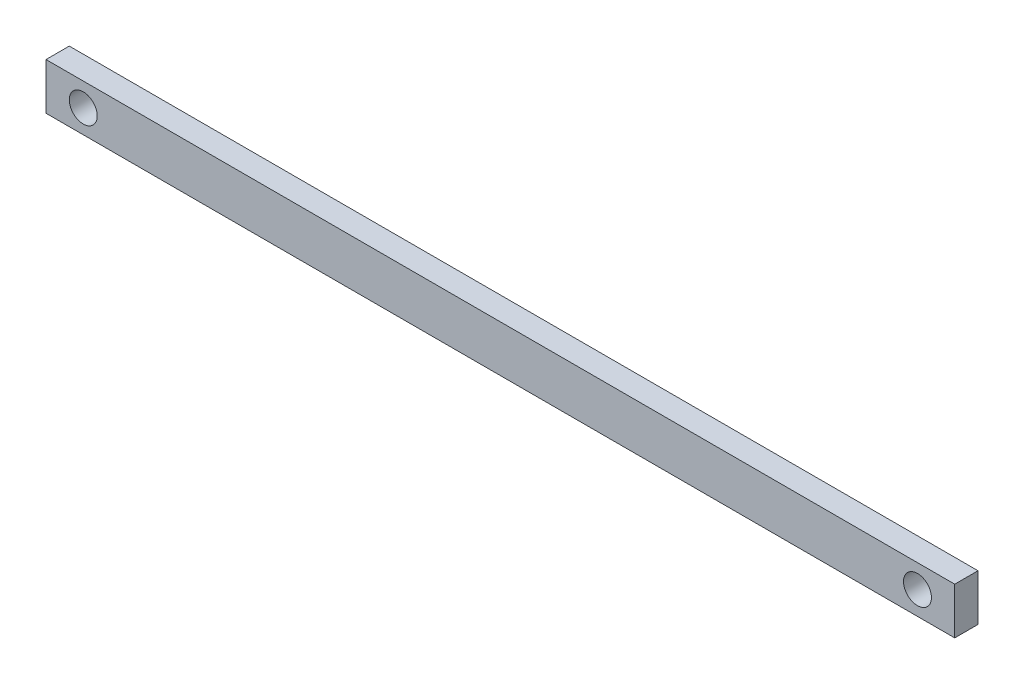
ISO-10303-21;
HEADER;
FILE_DESCRIPTION(('STEP AP214'),'2;1');
FILE_NAME('part.step','',(''),(''),'','','');
FILE_SCHEMA(('AUTOMOTIVE_DESIGN { 1 0 10303 214 1 1 1 1 }'));
ENDSEC;
DATA;
#1=APPLICATION_CONTEXT('core data for automotive mechanical design processes');
#2=APPLICATION_PROTOCOL_DEFINITION('international standard','automotive_design',2000,#1);
#3=PRODUCT_CONTEXT('',#1,'mechanical');
#4=PRODUCT('Part','Part','',(#3));
#5=PRODUCT_RELATED_PRODUCT_CATEGORY('part','',(#4));
#6=PRODUCT_DEFINITION_FORMATION('','',#4);
#7=PRODUCT_DEFINITION_CONTEXT('part definition',#1,'design');
#8=PRODUCT_DEFINITION('design','',#6,#7);
#9=PRODUCT_DEFINITION_SHAPE('','',#8);
#10=(LENGTH_UNIT() NAMED_UNIT(*) SI_UNIT(.MILLI.,.METRE.));
#11=(NAMED_UNIT(*) PLANE_ANGLE_UNIT() SI_UNIT($,.RADIAN.));
#12=(NAMED_UNIT(*) SI_UNIT($,.STERADIAN.) SOLID_ANGLE_UNIT());
#13=UNCERTAINTY_MEASURE_WITH_UNIT(LENGTH_MEASURE(1.E-05),#10,'distance_accuracy_value','');
#14=(GEOMETRIC_REPRESENTATION_CONTEXT(3) GLOBAL_UNCERTAINTY_ASSIGNED_CONTEXT((#13)) GLOBAL_UNIT_ASSIGNED_CONTEXT((#10,
#11,#12)) REPRESENTATION_CONTEXT('',''));
#15=CARTESIAN_POINT('',(0.,0.,0.));
#16=DIRECTION('',(0.,0.,1.));
#17=DIRECTION('',(1.,0.,0.));
#18=AXIS2_PLACEMENT_3D('',#15,#16,#17);
#19=CARTESIAN_POINT('',(0.,0.,25.));
#20=DIRECTION('',(0.,0.,1.));
#21=DIRECTION('',(1.,0.,0.));
#22=AXIS2_PLACEMENT_3D('',#19,#20,#21);
#23=PLANE('',#22);
#24=CARTESIAN_POINT('',(-224.,0.,25.));
#25=DIRECTION('',(0.,0.,1.));
#26=DIRECTION('',(1.,0.,0.));
#27=AXIS2_PLACEMENT_3D('',#24,#25,#26);
#28=CIRCLE('',#27,7.50000000000001);
#29=CARTESIAN_POINT('',(-216.5,0.,25.));
#30=VERTEX_POINT('',#29);
#31=EDGE_CURVE('E110',#30,#30,#28,.T.);
#32=ORIENTED_EDGE('',*,*,#31,.F.);
#33=EDGE_LOOP('',(#32));
#34=FACE_BOUND('',#33,.T.);
#35=DIRECTION('',(0.,1.,0.));
#36=VECTOR('',#35,1.);
#37=CARTESIAN_POINT('',(244.,12.5,25.));
#38=LINE('',#37,#36);
#39=CARTESIAN_POINT('',(244.,-12.5,25.));
#40=VERTEX_POINT('',#39);
#41=CARTESIAN_POINT('',(244.,12.5,25.));
#42=VERTEX_POINT('',#41);
#43=EDGE_CURVE('E108',#40,#42,#38,.T.);
#44=ORIENTED_EDGE('',*,*,#43,.T.);
#45=DIRECTION('',(-1.,0.,0.));
#46=VECTOR('',#45,1.);
#47=CARTESIAN_POINT('',(-244.,12.5,25.));
#48=LINE('',#47,#46);
#49=CARTESIAN_POINT('',(-244.,12.5,25.));
#50=VERTEX_POINT('',#49);
#51=EDGE_CURVE('E106',#42,#50,#48,.T.);
#52=ORIENTED_EDGE('',*,*,#51,.T.);
#53=DIRECTION('',(0.,-1.,0.));
#54=VECTOR('',#53,1.);
#55=CARTESIAN_POINT('',(-244.,12.5,25.));
#56=LINE('',#55,#54);
#57=CARTESIAN_POINT('',(-244.,-12.5,25.));
#58=VERTEX_POINT('',#57);
#59=EDGE_CURVE('E96',#50,#58,#56,.T.);
#60=ORIENTED_EDGE('',*,*,#59,.T.);
#61=DIRECTION('',(1.,0.,0.));
#62=VECTOR('',#61,1.);
#63=CARTESIAN_POINT('',(-244.,-12.5,25.));
#64=LINE('',#63,#62);
#65=EDGE_CURVE('E62',#58,#40,#64,.T.);
#66=ORIENTED_EDGE('',*,*,#65,.T.);
#67=EDGE_LOOP('',(#44,#52,#60,#66));
#68=FACE_BOUND('',#67,.T.);
#69=CARTESIAN_POINT('',(224.,0.,25.));
#70=DIRECTION('',(0.,0.,1.));
#71=DIRECTION('',(1.,0.,0.));
#72=AXIS2_PLACEMENT_3D('',#69,#70,#71);
#73=CIRCLE('',#72,7.50000000000001);
#74=CARTESIAN_POINT('',(231.5,0.,25.));
#75=VERTEX_POINT('',#74);
#76=EDGE_CURVE('E113',#75,#75,#73,.T.);
#77=ORIENTED_EDGE('',*,*,#76,.F.);
#78=EDGE_LOOP('',(#77));
#79=FACE_BOUND('',#78,.T.);
#80=ADVANCED_FACE('F38',(#34,#68,#79),#23,.T.);
#81=CARTESIAN_POINT('',(244.,12.5,25.));
#82=DIRECTION('',(-1.,0.,0.));
#83=DIRECTION('',(0.,0.,1.));
#84=AXIS2_PLACEMENT_3D('',#81,#82,#83);
#85=PLANE('',#84);
#86=DIRECTION('',(0.,0.,-1.));
#87=VECTOR('',#86,1.);
#88=CARTESIAN_POINT('',(244.,-12.5,25.));
#89=LINE('',#88,#87);
#90=CARTESIAN_POINT('',(244.,-12.5,12.5));
#91=VERTEX_POINT('',#90);
#92=EDGE_CURVE('E99',#40,#91,#89,.T.);
#93=ORIENTED_EDGE('',*,*,#92,.T.);
#94=DIRECTION('',(0.,1.,0.));
#95=VECTOR('',#94,1.);
#96=CARTESIAN_POINT('',(244.,12.5,12.5));
#97=LINE('',#96,#95);
#98=CARTESIAN_POINT('',(244.,12.5,12.5));
#99=VERTEX_POINT('',#98);
#100=EDGE_CURVE('E54',#91,#99,#97,.T.);
#101=ORIENTED_EDGE('',*,*,#100,.T.);
#102=DIRECTION('',(0.,0.,-1.));
#103=VECTOR('',#102,1.);
#104=CARTESIAN_POINT('',(244.,12.5,25.));
#105=LINE('',#104,#103);
#106=EDGE_CURVE('E11',#42,#99,#105,.T.);
#107=ORIENTED_EDGE('',*,*,#106,.F.);
#108=ORIENTED_EDGE('',*,*,#43,.F.);
#109=EDGE_LOOP('',(#93,#101,#107,#108));
#110=FACE_BOUND('',#109,.T.);
#111=ADVANCED_FACE('F40',(#110),#85,.F.);
#112=CARTESIAN_POINT('',(-244.,12.5,25.));
#113=DIRECTION('',(0.,-1.,0.));
#114=DIRECTION('',(0.,0.,-1.));
#115=AXIS2_PLACEMENT_3D('',#112,#113,#114);
#116=PLANE('',#115);
#117=ORIENTED_EDGE('',*,*,#106,.T.);
#118=DIRECTION('',(1.,0.,0.));
#119=VECTOR('',#118,1.);
#120=CARTESIAN_POINT('',(-244.,12.5,12.5));
#121=LINE('',#120,#119);
#122=CARTESIAN_POINT('',(-244.,12.5,12.5));
#123=VERTEX_POINT('',#122);
#124=EDGE_CURVE('E82',#123,#99,#121,.T.);
#125=ORIENTED_EDGE('',*,*,#124,.F.);
#126=DIRECTION('',(0.,0.,-1.));
#127=VECTOR('',#126,1.);
#128=CARTESIAN_POINT('',(-244.,12.5,25.));
#129=LINE('',#128,#127);
#130=EDGE_CURVE('E47',#50,#123,#129,.T.);
#131=ORIENTED_EDGE('',*,*,#130,.F.);
#132=ORIENTED_EDGE('',*,*,#51,.F.);
#133=EDGE_LOOP('',(#117,#125,#131,#132));
#134=FACE_BOUND('',#133,.T.);
#135=ADVANCED_FACE('F91',(#134),#116,.F.);
#136=CARTESIAN_POINT('',(-244.,12.5,25.));
#137=DIRECTION('',(1.,0.,0.));
#138=DIRECTION('',(0.,0.,-1.));
#139=AXIS2_PLACEMENT_3D('',#136,#137,#138);
#140=PLANE('',#139);
#141=ORIENTED_EDGE('',*,*,#130,.T.);
#142=DIRECTION('',(0.,-1.,0.));
#143=VECTOR('',#142,1.);
#144=CARTESIAN_POINT('',(-244.,12.5,12.5));
#145=LINE('',#144,#143);
#146=CARTESIAN_POINT('',(-244.,-12.5,12.5));
#147=VERTEX_POINT('',#146);
#148=EDGE_CURVE('E79',#123,#147,#145,.T.);
#149=ORIENTED_EDGE('',*,*,#148,.T.);
#150=DIRECTION('',(0.,0.,-1.));
#151=VECTOR('',#150,1.);
#152=CARTESIAN_POINT('',(-244.,-12.5,25.));
#153=LINE('',#152,#151);
#154=EDGE_CURVE('E97',#58,#147,#153,.T.);
#155=ORIENTED_EDGE('',*,*,#154,.F.);
#156=ORIENTED_EDGE('',*,*,#59,.F.);
#157=EDGE_LOOP('',(#141,#149,#155,#156));
#158=FACE_BOUND('',#157,.T.);
#159=ADVANCED_FACE('F95',(#158),#140,.F.);
#160=CARTESIAN_POINT('',(-244.,-12.5,25.));
#161=DIRECTION('',(0.,1.,0.));
#162=DIRECTION('',(0.,0.,1.));
#163=AXIS2_PLACEMENT_3D('',#160,#161,#162);
#164=PLANE('',#163);
#165=ORIENTED_EDGE('',*,*,#154,.T.);
#166=DIRECTION('',(1.,0.,0.));
#167=VECTOR('',#166,1.);
#168=CARTESIAN_POINT('',(-244.,-12.5,12.5));
#169=LINE('',#168,#167);
#170=EDGE_CURVE('E83',#147,#91,#169,.T.);
#171=ORIENTED_EDGE('',*,*,#170,.T.);
#172=ORIENTED_EDGE('',*,*,#92,.F.);
#173=ORIENTED_EDGE('',*,*,#65,.F.);
#174=EDGE_LOOP('',(#165,#171,#172,#173));
#175=FACE_BOUND('',#174,.T.);
#176=ADVANCED_FACE('F142',(#175),#164,.F.);
#177=CARTESIAN_POINT('',(-224.,0.,25.));
#178=DIRECTION('',(0.,0.,-1.));
#179=DIRECTION('',(-1.,0.,0.));
#180=AXIS2_PLACEMENT_3D('',#177,#178,#179);
#181=CYLINDRICAL_SURFACE('',#180,7.50000000000001);
#182=CARTESIAN_POINT('',(-224.,0.,12.5));
#183=DIRECTION('',(0.,0.,1.));
#184=DIRECTION('',(1.,0.,0.));
#185=AXIS2_PLACEMENT_3D('',#182,#183,#184);
#186=CIRCLE('',#185,7.50000000000001);
#187=CARTESIAN_POINT('',(-216.5,0.,12.5));
#188=VERTEX_POINT('',#187);
#189=EDGE_CURVE('E117',#188,#188,#186,.T.);
#190=ORIENTED_EDGE('',*,*,#189,.F.);
#191=EDGE_LOOP('',(#190));
#192=FACE_BOUND('',#191,.T.);
#193=ORIENTED_EDGE('',*,*,#31,.T.);
#194=EDGE_LOOP('',(#193));
#195=FACE_BOUND('',#194,.T.);
#196=ADVANCED_FACE('F128',(#192,#195),#181,.F.);
#197=CARTESIAN_POINT('',(224.,0.,25.));
#198=DIRECTION('',(0.,0.,-1.));
#199=DIRECTION('',(-1.,0.,0.));
#200=AXIS2_PLACEMENT_3D('',#197,#198,#199);
#201=CYLINDRICAL_SURFACE('',#200,7.50000000000001);
#202=CARTESIAN_POINT('',(224.,0.,12.5));
#203=DIRECTION('',(0.,0.,1.));
#204=DIRECTION('',(1.,0.,0.));
#205=AXIS2_PLACEMENT_3D('',#202,#203,#204);
#206=CIRCLE('',#205,7.50000000000001);
#207=CARTESIAN_POINT('',(231.5,0.,12.5));
#208=VERTEX_POINT('',#207);
#209=EDGE_CURVE('E42',#208,#208,#206,.T.);
#210=ORIENTED_EDGE('',*,*,#209,.F.);
#211=EDGE_LOOP('',(#210));
#212=FACE_BOUND('',#211,.T.);
#213=ORIENTED_EDGE('',*,*,#76,.T.);
#214=EDGE_LOOP('',(#213));
#215=FACE_BOUND('',#214,.T.);
#216=ADVANCED_FACE('F125',(#212,#215),#201,.F.);
#217=CARTESIAN_POINT('',(-244.,12.5,12.5));
#218=DIRECTION('',(0.,0.,1.));
#219=DIRECTION('',(1.,0.,0.));
#220=AXIS2_PLACEMENT_3D('',#217,#218,#219);
#221=PLANE('',#220);
#222=ORIENTED_EDGE('',*,*,#189,.T.);
#223=EDGE_LOOP('',(#222));
#224=FACE_BOUND('',#223,.T.);
#225=ORIENTED_EDGE('',*,*,#209,.T.);
#226=EDGE_LOOP('',(#225));
#227=FACE_BOUND('',#226,.T.);
#228=ORIENTED_EDGE('',*,*,#170,.F.);
#229=ORIENTED_EDGE('',*,*,#148,.F.);
#230=ORIENTED_EDGE('',*,*,#124,.T.);
#231=ORIENTED_EDGE('',*,*,#100,.F.);
#232=EDGE_LOOP('',(#228,#229,#230,#231));
#233=FACE_BOUND('',#232,.T.);
#234=ADVANCED_FACE('F81',(#224,#227,#233),#221,.F.);
#235=CLOSED_SHELL('',(#80,#111,#135,#159,#176,#196,#216,#234));
#236=MANIFOLD_SOLID_BREP('B2',#235);
#237=ADVANCED_BREP_SHAPE_REPRESENTATION('',(#18,#236),#14);
#238=SHAPE_DEFINITION_REPRESENTATION(#9,#237);
ENDSEC;
END-ISO-10303-21;
